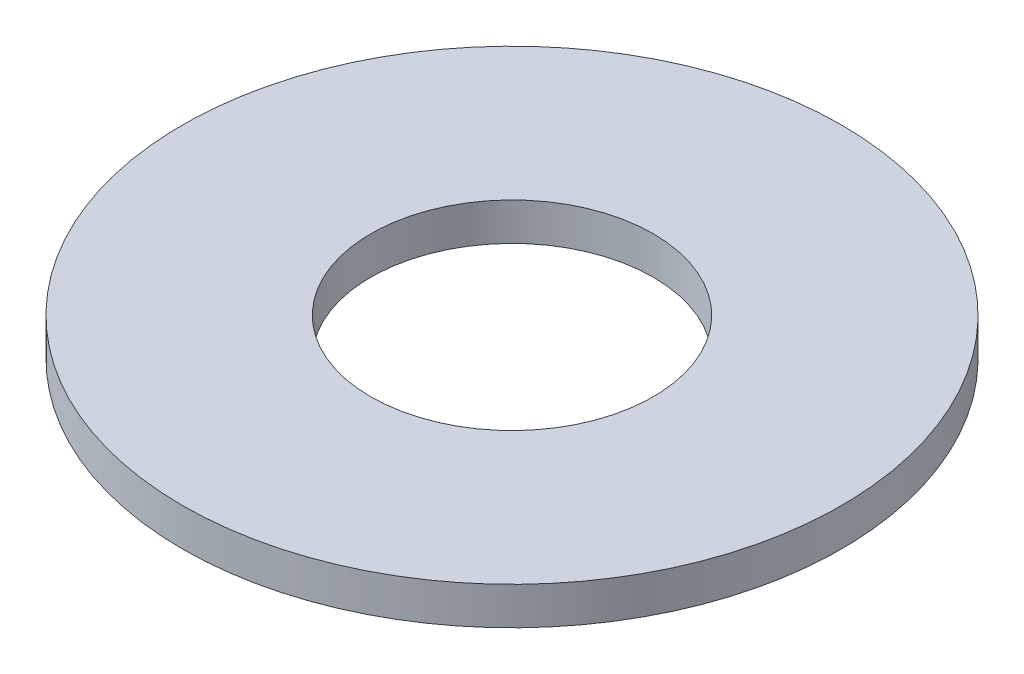
ISO-10303-21;
HEADER;
FILE_DESCRIPTION(('STEP AP214'),'2;1');
FILE_NAME('part.step','',(''),(''),'','','');
FILE_SCHEMA(('AUTOMOTIVE_DESIGN { 1 0 10303 214 1 1 1 1 }'));
ENDSEC;
DATA;
#1=APPLICATION_CONTEXT('core data for automotive mechanical design processes');
#2=APPLICATION_PROTOCOL_DEFINITION('international standard','automotive_design',2000,#1);
#3=PRODUCT_CONTEXT('',#1,'mechanical');
#4=PRODUCT('Part','Part','',(#3));
#5=PRODUCT_RELATED_PRODUCT_CATEGORY('part','',(#4));
#6=PRODUCT_DEFINITION_FORMATION('','',#4);
#7=PRODUCT_DEFINITION_CONTEXT('part definition',#1,'design');
#8=PRODUCT_DEFINITION('design','',#6,#7);
#9=PRODUCT_DEFINITION_SHAPE('','',#8);
#10=(LENGTH_UNIT() NAMED_UNIT(*) SI_UNIT(.MILLI.,.METRE.));
#11=(NAMED_UNIT(*) PLANE_ANGLE_UNIT() SI_UNIT($,.RADIAN.));
#12=(NAMED_UNIT(*) SI_UNIT($,.STERADIAN.) SOLID_ANGLE_UNIT());
#13=UNCERTAINTY_MEASURE_WITH_UNIT(LENGTH_MEASURE(1.E-05),#10,'distance_accuracy_value','');
#14=(GEOMETRIC_REPRESENTATION_CONTEXT(3) GLOBAL_UNCERTAINTY_ASSIGNED_CONTEXT((#13)) GLOBAL_UNIT_ASSIGNED_CONTEXT((#10,
#11,#12)) REPRESENTATION_CONTEXT('',''));
#15=CARTESIAN_POINT('',(0.,0.,0.));
#16=DIRECTION('',(0.,0.,1.));
#17=DIRECTION('',(1.,0.,0.));
#18=AXIS2_PLACEMENT_3D('',#15,#16,#17);
#19=CARTESIAN_POINT('',(0.,0.4,0.));
#20=DIRECTION('',(0.,1.,0.));
#21=DIRECTION('',(0.,0.,1.));
#22=AXIS2_PLACEMENT_3D('',#19,#20,#21);
#23=PLANE('',#22);
#24=CARTESIAN_POINT('',(0.,0.4,0.));
#25=DIRECTION('',(0.,1.,0.));
#26=DIRECTION('',(0.,0.,1.));
#27=AXIS2_PLACEMENT_3D('',#24,#25,#26);
#28=CIRCLE('',#27,3.5);
#29=CARTESIAN_POINT('',(0.,0.4,3.5));
#30=VERTEX_POINT('',#29);
#31=EDGE_CURVE('E10',#30,#30,#28,.T.);
#32=ORIENTED_EDGE('',*,*,#31,.T.);
#33=EDGE_LOOP('',(#32));
#34=FACE_BOUND('',#33,.T.);
#35=CARTESIAN_POINT('',(0.,0.4,0.));
#36=DIRECTION('',(0.,1.,0.));
#37=DIRECTION('',(0.,0.,1.));
#38=AXIS2_PLACEMENT_3D('',#35,#36,#37);
#39=CIRCLE('',#38,1.5);
#40=CARTESIAN_POINT('',(0.,0.4,1.5));
#41=VERTEX_POINT('',#40);
#42=EDGE_CURVE('E42',#41,#41,#39,.T.);
#43=ORIENTED_EDGE('',*,*,#42,.F.);
#44=EDGE_LOOP('',(#43));
#45=FACE_BOUND('',#44,.T.);
#46=ADVANCED_FACE('F31',(#34,#45),#23,.T.);
#47=CARTESIAN_POINT('',(0.,0.,0.));
#48=DIRECTION('',(0.,1.,0.));
#49=DIRECTION('',(0.,0.,1.));
#50=AXIS2_PLACEMENT_3D('',#47,#48,#49);
#51=PLANE('',#50);
#52=CARTESIAN_POINT('',(0.,0.,0.));
#53=DIRECTION('',(0.,1.,0.));
#54=DIRECTION('',(0.,0.,1.));
#55=AXIS2_PLACEMENT_3D('',#52,#53,#54);
#56=CIRCLE('',#55,3.5);
#57=CARTESIAN_POINT('',(0.,0.,3.5));
#58=VERTEX_POINT('',#57);
#59=EDGE_CURVE('E35',#58,#58,#56,.T.);
#60=ORIENTED_EDGE('',*,*,#59,.F.);
#61=EDGE_LOOP('',(#60));
#62=FACE_BOUND('',#61,.T.);
#63=CARTESIAN_POINT('',(0.,0.,0.));
#64=DIRECTION('',(0.,1.,0.));
#65=DIRECTION('',(0.,0.,1.));
#66=AXIS2_PLACEMENT_3D('',#63,#64,#65);
#67=CIRCLE('',#66,1.5);
#68=CARTESIAN_POINT('',(0.,0.,1.5));
#69=VERTEX_POINT('',#68);
#70=EDGE_CURVE('E44',#69,#69,#67,.T.);
#71=ORIENTED_EDGE('',*,*,#70,.T.);
#72=EDGE_LOOP('',(#71));
#73=FACE_BOUND('',#72,.T.);
#74=ADVANCED_FACE('F54',(#62,#73),#51,.F.);
#75=CARTESIAN_POINT('',(0.,0.4,0.));
#76=DIRECTION('',(0.,-1.,0.));
#77=DIRECTION('',(0.,0.,-1.));
#78=AXIS2_PLACEMENT_3D('',#75,#76,#77);
#79=CYLINDRICAL_SURFACE('',#78,3.5);
#80=ORIENTED_EDGE('',*,*,#31,.F.);
#81=EDGE_LOOP('',(#80));
#82=FACE_BOUND('',#81,.T.);
#83=ORIENTED_EDGE('',*,*,#59,.T.);
#84=EDGE_LOOP('',(#83));
#85=FACE_BOUND('',#84,.T.);
#86=ADVANCED_FACE('F33',(#82,#85),#79,.T.);
#87=CARTESIAN_POINT('',(0.,0.4,0.));
#88=DIRECTION('',(0.,-1.,0.));
#89=DIRECTION('',(0.,0.,-1.));
#90=AXIS2_PLACEMENT_3D('',#87,#88,#89);
#91=CYLINDRICAL_SURFACE('',#90,1.5);
#92=ORIENTED_EDGE('',*,*,#42,.T.);
#93=EDGE_LOOP('',(#92));
#94=FACE_BOUND('',#93,.T.);
#95=ORIENTED_EDGE('',*,*,#70,.F.);
#96=EDGE_LOOP('',(#95));
#97=FACE_BOUND('',#96,.T.);
#98=ADVANCED_FACE('F50',(#94,#97),#91,.F.);
#99=CLOSED_SHELL('',(#46,#74,#86,#98));
#100=MANIFOLD_SOLID_BREP('B2',#99);
#101=ADVANCED_BREP_SHAPE_REPRESENTATION('',(#18,#100),#14);
#102=SHAPE_DEFINITION_REPRESENTATION(#9,#101);
ENDSEC;
END-ISO-10303-21;
